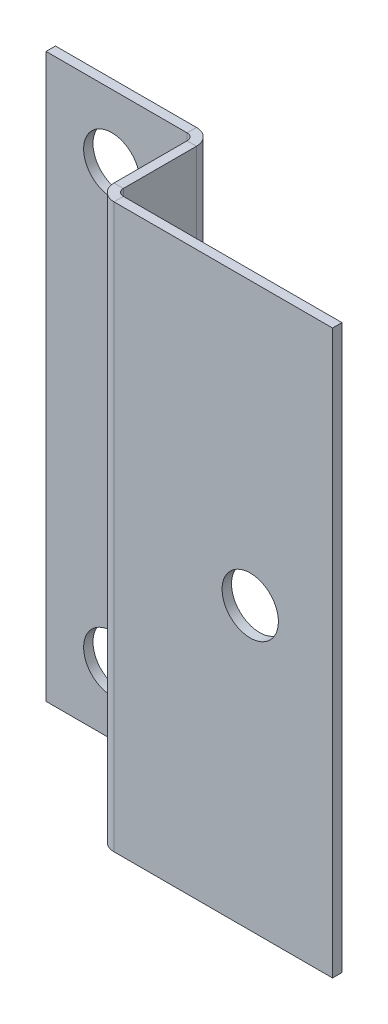
ISO-10303-21;
HEADER;
FILE_DESCRIPTION(('STEP AP214'),'2;1');
FILE_NAME('part.step','',(''),(''),'','','');
FILE_SCHEMA(('AUTOMOTIVE_DESIGN { 1 0 10303 214 1 1 1 1 }'));
ENDSEC;
DATA;
#1=APPLICATION_CONTEXT('core data for automotive mechanical design processes');
#2=APPLICATION_PROTOCOL_DEFINITION('international standard','automotive_design',2000,#1);
#3=PRODUCT_CONTEXT('',#1,'mechanical');
#4=PRODUCT('Part','Part','',(#3));
#5=PRODUCT_RELATED_PRODUCT_CATEGORY('part','',(#4));
#6=PRODUCT_DEFINITION_FORMATION('','',#4);
#7=PRODUCT_DEFINITION_CONTEXT('part definition',#1,'design');
#8=PRODUCT_DEFINITION('design','',#6,#7);
#9=PRODUCT_DEFINITION_SHAPE('','',#8);
#10=(LENGTH_UNIT() NAMED_UNIT(*) SI_UNIT(.MILLI.,.METRE.));
#11=(NAMED_UNIT(*) PLANE_ANGLE_UNIT() SI_UNIT($,.RADIAN.));
#12=(NAMED_UNIT(*) SI_UNIT($,.STERADIAN.) SOLID_ANGLE_UNIT());
#13=UNCERTAINTY_MEASURE_WITH_UNIT(LENGTH_MEASURE(1.E-05),#10,'distance_accuracy_value','');
#14=(GEOMETRIC_REPRESENTATION_CONTEXT(3) GLOBAL_UNCERTAINTY_ASSIGNED_CONTEXT((#13)) GLOBAL_UNIT_ASSIGNED_CONTEXT((#10,
#11,#12)) REPRESENTATION_CONTEXT('',''));
#15=CARTESIAN_POINT('',(0.,0.,0.));
#16=DIRECTION('',(0.,0.,1.));
#17=DIRECTION('',(1.,0.,0.));
#18=AXIS2_PLACEMENT_3D('',#15,#16,#17);
#19=CARTESIAN_POINT('',(-9.23462336885732,0.,8.76537663114272));
#20=DIRECTION('',(1.,0.,0.));
#21=DIRECTION('',(0.,0.,-1.));
#22=AXIS2_PLACEMENT_3D('',#19,#20,#21);
#23=PLANE('',#22);
#24=DIRECTION('',(0.,0.,1.));
#25=VECTOR('',#24,1.);
#26=CARTESIAN_POINT('',(-9.23462336885723,-30.,-16.2346233688573));
#27=LINE('',#26,#25);
#28=CARTESIAN_POINT('',(-9.23462336885729,-30.,0.736600000000002));
#29=VERTEX_POINT('',#28);
#30=CARTESIAN_POINT('',(-9.23462336885732,-30.,8.5287766311427));
#31=VERTEX_POINT('',#30);
#32=EDGE_CURVE('E74',#29,#31,#27,.T.);
#33=ORIENTED_EDGE('',*,*,#32,.T.);
#34=DIRECTION('',(0.,1.,0.));
#35=VECTOR('',#34,1.);
#36=CARTESIAN_POINT('',(-9.23462336885732,0.,8.5287766311427));
#37=LINE('',#36,#35);
#38=CARTESIAN_POINT('',(-9.23462336885732,30.,8.5287766311427));
#39=VERTEX_POINT('',#38);
#40=EDGE_CURVE('E66',#31,#39,#37,.T.);
#41=ORIENTED_EDGE('',*,*,#40,.T.);
#42=DIRECTION('',(0.,0.,-1.));
#43=VECTOR('',#42,1.);
#44=CARTESIAN_POINT('',(-9.23462336885724,30.,-16.2346233688573));
#45=LINE('',#44,#43);
#46=CARTESIAN_POINT('',(-9.23462336885729,30.,0.736600000000009));
#47=VERTEX_POINT('',#46);
#48=EDGE_CURVE('E82',#39,#47,#45,.T.);
#49=ORIENTED_EDGE('',*,*,#48,.T.);
#50=DIRECTION('',(0.,-1.,0.));
#51=VECTOR('',#50,1.);
#52=CARTESIAN_POINT('',(-9.23462336885729,0.,0.736600000000004));
#53=LINE('',#52,#51);
#54=EDGE_CURVE('E244',#47,#29,#53,.T.);
#55=ORIENTED_EDGE('',*,*,#54,.T.);
#56=EDGE_LOOP('',(#33,#41,#49,#55));
#57=FACE_BOUND('',#56,.T.);
#58=ADVANCED_FACE('F57',(#57),#23,.F.);
#59=CARTESIAN_POINT('',(-8.23462336885723,-30.,-16.2346233688573));
#60=DIRECTION('',(0.,-1.,0.));
#61=DIRECTION('',(1.,0.,0.));
#62=AXIS2_PLACEMENT_3D('',#59,#60,#61);
#63=PLANE('',#62);
#64=DIRECTION('',(1.,0.,0.));
#65=VECTOR('',#64,1.);
#66=CARTESIAN_POINT('',(-8.23462336885731,-30.,8.5287766311427));
#67=LINE('',#66,#65);
#68=CARTESIAN_POINT('',(-8.23462336885732,-30.,8.5287766311427));
#69=VERTEX_POINT('',#68);
#70=EDGE_CURVE('E14',#31,#69,#67,.T.);
#71=ORIENTED_EDGE('',*,*,#70,.F.);
#72=ORIENTED_EDGE('',*,*,#32,.F.);
#73=DIRECTION('',(-1.,0.,0.));
#74=VECTOR('',#73,1.);
#75=CARTESIAN_POINT('',(-8.23462336885729,-30.,0.736600000000006));
#76=LINE('',#75,#74);
#77=CARTESIAN_POINT('',(-8.23462336885729,-30.,0.736600000000005));
#78=VERTEX_POINT('',#77);
#79=EDGE_CURVE('E240',#78,#29,#76,.T.);
#80=ORIENTED_EDGE('',*,*,#79,.F.);
#81=DIRECTION('',(0.,0.,1.));
#82=VECTOR('',#81,1.);
#83=CARTESIAN_POINT('',(-8.23462336885723,-30.,-16.2346233688573));
#84=LINE('',#83,#82);
#85=EDGE_CURVE('E241',#78,#69,#84,.T.);
#86=ORIENTED_EDGE('',*,*,#85,.T.);
#87=EDGE_LOOP('',(#71,#72,#80,#86));
#88=FACE_BOUND('',#87,.T.);
#89=ADVANCED_FACE('F59',(#88),#63,.T.);
#90=CARTESIAN_POINT('',(-8.23462336885724,30.,-16.2346233688573));
#91=DIRECTION('',(0.,1.,0.));
#92=DIRECTION('',(-1.,0.,0.));
#93=AXIS2_PLACEMENT_3D('',#90,#91,#92);
#94=PLANE('',#93);
#95=DIRECTION('',(-1.,0.,0.));
#96=VECTOR('',#95,1.);
#97=CARTESIAN_POINT('',(-8.23462336885732,30.,8.52877663114271));
#98=LINE('',#97,#96);
#99=CARTESIAN_POINT('',(-8.23462336885732,30.,8.5287766311427));
#100=VERTEX_POINT('',#99);
#101=EDGE_CURVE('E252',#100,#39,#98,.T.);
#102=ORIENTED_EDGE('',*,*,#101,.F.);
#103=DIRECTION('',(0.,0.,-1.));
#104=VECTOR('',#103,1.);
#105=CARTESIAN_POINT('',(-8.23462336885724,30.,-16.2346233688573));
#106=LINE('',#105,#104);
#107=CARTESIAN_POINT('',(-8.23462336885729,30.,0.736600000000013));
#108=VERTEX_POINT('',#107);
#109=EDGE_CURVE('E257',#100,#108,#106,.T.);
#110=ORIENTED_EDGE('',*,*,#109,.T.);
#111=DIRECTION('',(1.,0.,0.));
#112=VECTOR('',#111,1.);
#113=CARTESIAN_POINT('',(-8.23462336885729,30.,0.736600000000006));
#114=LINE('',#113,#112);
#115=EDGE_CURVE('E246',#47,#108,#114,.T.);
#116=ORIENTED_EDGE('',*,*,#115,.F.);
#117=ORIENTED_EDGE('',*,*,#48,.F.);
#118=EDGE_LOOP('',(#102,#110,#116,#117));
#119=FACE_BOUND('',#118,.T.);
#120=ADVANCED_FACE('F310',(#119),#94,.T.);
#121=CARTESIAN_POINT('',(-8.23462336885732,0.,8.76537663114272));
#122=DIRECTION('',(1.,0.,0.));
#123=DIRECTION('',(0.,0.,-1.));
#124=AXIS2_PLACEMENT_3D('',#121,#122,#123);
#125=PLANE('',#124);
#126=DIRECTION('',(0.,1.,0.));
#127=VECTOR('',#126,1.);
#128=CARTESIAN_POINT('',(-8.23462336885732,0.,8.5287766311427));
#129=LINE('',#128,#127);
#130=EDGE_CURVE('E249',#69,#100,#129,.T.);
#131=ORIENTED_EDGE('',*,*,#130,.F.);
#132=ORIENTED_EDGE('',*,*,#85,.F.);
#133=DIRECTION('',(0.,-1.,0.));
#134=VECTOR('',#133,1.);
#135=CARTESIAN_POINT('',(-8.23462336885729,0.,0.736600000000007));
#136=LINE('',#135,#134);
#137=EDGE_CURVE('E237',#108,#78,#136,.T.);
#138=ORIENTED_EDGE('',*,*,#137,.F.);
#139=ORIENTED_EDGE('',*,*,#109,.F.);
#140=EDGE_LOOP('',(#131,#132,#138,#139));
#141=FACE_BOUND('',#140,.T.);
#142=ADVANCED_FACE('F301',(#141),#125,.T.);
#143=CARTESIAN_POINT('',(-25.,-30.,-1.));
#144=DIRECTION('',(-1.,0.,0.));
#145=DIRECTION('',(0.,0.,1.));
#146=AXIS2_PLACEMENT_3D('',#143,#144,#145);
#147=PLANE('',#146);
#148=DIRECTION('',(0.,-1.,0.));
#149=VECTOR('',#148,1.);
#150=CARTESIAN_POINT('',(-25.,-30.,0.));
#151=LINE('',#150,#149);
#152=CARTESIAN_POINT('',(-25.,30.,0.));
#153=VERTEX_POINT('',#152);
#154=CARTESIAN_POINT('',(-25.,-30.,0.));
#155=VERTEX_POINT('',#154);
#156=EDGE_CURVE('E216',#153,#155,#151,.T.);
#157=ORIENTED_EDGE('',*,*,#156,.F.);
#158=DIRECTION('',(0.,0.,1.));
#159=VECTOR('',#158,1.);
#160=CARTESIAN_POINT('',(-25.,30.,-1.));
#161=LINE('',#160,#159);
#162=CARTESIAN_POINT('',(-25.,30.,-1.));
#163=VERTEX_POINT('',#162);
#164=EDGE_CURVE('E205',#163,#153,#161,.T.);
#165=ORIENTED_EDGE('',*,*,#164,.F.);
#166=DIRECTION('',(0.,-1.,0.));
#167=VECTOR('',#166,1.);
#168=CARTESIAN_POINT('',(-25.,-30.,-1.));
#169=LINE('',#168,#167);
#170=CARTESIAN_POINT('',(-25.,-30.,-1.));
#171=VERTEX_POINT('',#170);
#172=EDGE_CURVE('E232',#163,#171,#169,.T.);
#173=ORIENTED_EDGE('',*,*,#172,.T.);
#174=DIRECTION('',(0.,0.,1.));
#175=VECTOR('',#174,1.);
#176=CARTESIAN_POINT('',(-25.,-30.,-1.));
#177=LINE('',#176,#175);
#178=EDGE_CURVE('E230',#171,#155,#177,.T.);
#179=ORIENTED_EDGE('',*,*,#178,.T.);
#180=EDGE_LOOP('',(#157,#165,#173,#179));
#181=FACE_BOUND('',#180,.T.);
#182=ADVANCED_FACE('F330',(#181),#147,.T.);
#183=CARTESIAN_POINT('',(0.,0.,-1.));
#184=DIRECTION('',(0.,0.,-1.));
#185=DIRECTION('',(-1.,0.,0.));
#186=AXIS2_PLACEMENT_3D('',#183,#184,#185);
#187=PLANE('',#186);
#188=CARTESIAN_POINT('',(-18.,-23.,-1.));
#189=DIRECTION('',(0.,0.,-1.));
#190=DIRECTION('',(-1.,0.,0.));
#191=AXIS2_PLACEMENT_3D('',#188,#189,#190);
#192=CIRCLE('',#191,3.);
#193=CARTESIAN_POINT('',(-21.,-23.,-1.));
#194=VERTEX_POINT('',#193);
#195=EDGE_CURVE('E265',#194,#194,#192,.T.);
#196=ORIENTED_EDGE('',*,*,#195,.F.);
#197=EDGE_LOOP('',(#196));
#198=FACE_BOUND('',#197,.T.);
#199=CARTESIAN_POINT('',(-18.,23.,-1.));
#200=DIRECTION('',(0.,0.,-1.));
#201=DIRECTION('',(-1.,0.,0.));
#202=AXIS2_PLACEMENT_3D('',#199,#200,#201);
#203=CIRCLE('',#202,3.);
#204=CARTESIAN_POINT('',(-21.,23.,-1.));
#205=VERTEX_POINT('',#204);
#206=EDGE_CURVE('E262',#205,#205,#203,.T.);
#207=ORIENTED_EDGE('',*,*,#206,.F.);
#208=EDGE_LOOP('',(#207));
#209=FACE_BOUND('',#208,.T.);
#210=DIRECTION('',(-1.,0.,0.));
#211=VECTOR('',#210,1.);
#212=CARTESIAN_POINT('',(-25.,30.,-1.));
#213=LINE('',#212,#211);
#214=CARTESIAN_POINT('',(-9.97122336885729,30.,-1.));
#215=VERTEX_POINT('',#214);
#216=EDGE_CURVE('E208',#215,#163,#213,.T.);
#217=ORIENTED_EDGE('',*,*,#216,.F.);
#218=DIRECTION('',(0.,-1.,0.));
#219=VECTOR('',#218,1.);
#220=CARTESIAN_POINT('',(-9.97122336885729,0.,-1.));
#221=LINE('',#220,#219);
#222=CARTESIAN_POINT('',(-9.97122336885728,-30.,-1.));
#223=VERTEX_POINT('',#222);
#224=EDGE_CURVE('E227',#215,#223,#221,.T.);
#225=ORIENTED_EDGE('',*,*,#224,.T.);
#226=DIRECTION('',(1.,0.,0.));
#227=VECTOR('',#226,1.);
#228=CARTESIAN_POINT('',(-25.,-30.,-1.));
#229=LINE('',#228,#227);
#230=EDGE_CURVE('E224',#171,#223,#229,.T.);
#231=ORIENTED_EDGE('',*,*,#230,.F.);
#232=ORIENTED_EDGE('',*,*,#172,.F.);
#233=EDGE_LOOP('',(#217,#225,#231,#232));
#234=FACE_BOUND('',#233,.T.);
#235=ADVANCED_FACE('F322',(#198,#209,#234),#187,.T.);
#236=CARTESIAN_POINT('',(-25.,-30.,-1.));
#237=DIRECTION('',(0.,-1.,0.));
#238=DIRECTION('',(0.,0.,-1.));
#239=AXIS2_PLACEMENT_3D('',#236,#237,#238);
#240=PLANE('',#239);
#241=ORIENTED_EDGE('',*,*,#230,.T.);
#242=DIRECTION('',(0.,0.,1.));
#243=VECTOR('',#242,1.);
#244=CARTESIAN_POINT('',(-9.97122336885728,-30.,-1.));
#245=LINE('',#244,#243);
#246=CARTESIAN_POINT('',(-9.97122336885729,-30.,0.));
#247=VERTEX_POINT('',#246);
#248=EDGE_CURVE('E221',#223,#247,#245,.T.);
#249=ORIENTED_EDGE('',*,*,#248,.T.);
#250=DIRECTION('',(1.,0.,0.));
#251=VECTOR('',#250,1.);
#252=CARTESIAN_POINT('',(-25.,-30.,0.));
#253=LINE('',#252,#251);
#254=EDGE_CURVE('E213',#155,#247,#253,.T.);
#255=ORIENTED_EDGE('',*,*,#254,.F.);
#256=ORIENTED_EDGE('',*,*,#178,.F.);
#257=EDGE_LOOP('',(#241,#249,#255,#256));
#258=FACE_BOUND('',#257,.T.);
#259=ADVANCED_FACE('F325',(#258),#240,.T.);
#260=CARTESIAN_POINT('',(0.,0.,0.));
#261=DIRECTION('',(0.,0.,-1.));
#262=DIRECTION('',(-1.,0.,0.));
#263=AXIS2_PLACEMENT_3D('',#260,#261,#262);
#264=PLANE('',#263);
#265=CARTESIAN_POINT('',(-18.,-23.,0.));
#266=DIRECTION('',(0.,0.,-1.));
#267=DIRECTION('',(-1.,0.,0.));
#268=AXIS2_PLACEMENT_3D('',#265,#266,#267);
#269=CIRCLE('',#268,3.);
#270=CARTESIAN_POINT('',(-21.,-23.,0.));
#271=VERTEX_POINT('',#270);
#272=EDGE_CURVE('E263',#271,#271,#269,.T.);
#273=ORIENTED_EDGE('',*,*,#272,.T.);
#274=EDGE_LOOP('',(#273));
#275=FACE_BOUND('',#274,.T.);
#276=CARTESIAN_POINT('',(-18.,23.,0.));
#277=DIRECTION('',(0.,0.,-1.));
#278=DIRECTION('',(-1.,0.,0.));
#279=AXIS2_PLACEMENT_3D('',#276,#277,#278);
#280=CIRCLE('',#279,3.);
#281=CARTESIAN_POINT('',(-21.,23.,0.));
#282=VERTEX_POINT('',#281);
#283=EDGE_CURVE('E178',#282,#282,#280,.T.);
#284=ORIENTED_EDGE('',*,*,#283,.T.);
#285=EDGE_LOOP('',(#284));
#286=FACE_BOUND('',#285,.T.);
#287=DIRECTION('',(0.,-1.,0.));
#288=VECTOR('',#287,1.);
#289=CARTESIAN_POINT('',(-9.97122336885729,0.,0.));
#290=LINE('',#289,#288);
#291=CARTESIAN_POINT('',(-9.97122336885729,30.,0.));
#292=VERTEX_POINT('',#291);
#293=EDGE_CURVE('E201',#292,#247,#290,.T.);
#294=ORIENTED_EDGE('',*,*,#293,.F.);
#295=DIRECTION('',(-1.,0.,0.));
#296=VECTOR('',#295,1.);
#297=CARTESIAN_POINT('',(-25.,30.,0.));
#298=LINE('',#297,#296);
#299=EDGE_CURVE('E219',#292,#153,#298,.T.);
#300=ORIENTED_EDGE('',*,*,#299,.T.);
#301=ORIENTED_EDGE('',*,*,#156,.T.);
#302=ORIENTED_EDGE('',*,*,#254,.T.);
#303=EDGE_LOOP('',(#294,#300,#301,#302));
#304=FACE_BOUND('',#303,.T.);
#305=ADVANCED_FACE('F360',(#275,#286,#304),#264,.F.);
#306=CARTESIAN_POINT('',(-25.,30.,-1.));
#307=DIRECTION('',(0.,1.,0.));
#308=DIRECTION('',(0.,0.,1.));
#309=AXIS2_PLACEMENT_3D('',#306,#307,#308);
#310=PLANE('',#309);
#311=ORIENTED_EDGE('',*,*,#299,.F.);
#312=DIRECTION('',(0.,0.,-1.));
#313=VECTOR('',#312,1.);
#314=CARTESIAN_POINT('',(-9.97122336885729,30.,-1.));
#315=LINE('',#314,#313);
#316=EDGE_CURVE('E210',#292,#215,#315,.T.);
#317=ORIENTED_EDGE('',*,*,#316,.T.);
#318=ORIENTED_EDGE('',*,*,#216,.T.);
#319=ORIENTED_EDGE('',*,*,#164,.T.);
#320=EDGE_LOOP('',(#311,#317,#318,#319));
#321=FACE_BOUND('',#320,.T.);
#322=ADVANCED_FACE('F333',(#321),#310,.T.);
#323=CARTESIAN_POINT('',(-9.97122336885729,30.,0.7366));
#324=DIRECTION('',(0.,1.,0.));
#325=DIRECTION('',(0.,0.,1.));
#326=AXIS2_PLACEMENT_3D('',#323,#324,#325);
#327=PLANE('',#326);
#328=ORIENTED_EDGE('',*,*,#316,.F.);
#329=CARTESIAN_POINT('',(-9.97122336885729,30.,0.7366));
#330=DIRECTION('',(0.,-1.,0.));
#331=DIRECTION('',(1.,0.,0.));
#332=AXIS2_PLACEMENT_3D('',#329,#330,#331);
#333=CIRCLE('',#332,0.7366);
#334=EDGE_CURVE('E189',#292,#47,#333,.T.);
#335=ORIENTED_EDGE('',*,*,#334,.T.);
#336=ORIENTED_EDGE('',*,*,#115,.T.);
#337=CARTESIAN_POINT('',(-9.97122336885729,30.,0.7366));
#338=DIRECTION('',(0.,-1.,0.));
#339=DIRECTION('',(0.,0.,1.));
#340=AXIS2_PLACEMENT_3D('',#337,#338,#339);
#341=CIRCLE('',#340,1.7366);
#342=EDGE_CURVE('E194',#215,#108,#341,.T.);
#343=ORIENTED_EDGE('',*,*,#342,.F.);
#344=EDGE_LOOP('',(#328,#335,#336,#343));
#345=FACE_BOUND('',#344,.T.);
#346=ADVANCED_FACE('F316',(#345),#327,.T.);
#347=CARTESIAN_POINT('',(-9.97122336885728,-30.,0.7366));
#348=DIRECTION('',(0.,-1.,0.));
#349=DIRECTION('',(0.,0.,-1.));
#350=AXIS2_PLACEMENT_3D('',#347,#348,#349);
#351=PLANE('',#350);
#352=CARTESIAN_POINT('',(-9.97122336885728,-30.,0.7366));
#353=DIRECTION('',(0.,-1.,0.));
#354=DIRECTION('',(1.,0.,0.));
#355=AXIS2_PLACEMENT_3D('',#352,#353,#354);
#356=CIRCLE('',#355,0.7366);
#357=EDGE_CURVE('E198',#29,#247,#356,.F.);
#358=ORIENTED_EDGE('',*,*,#357,.T.);
#359=ORIENTED_EDGE('',*,*,#248,.F.);
#360=CARTESIAN_POINT('',(-9.97122336885728,-30.,0.7366));
#361=DIRECTION('',(0.,1.,0.));
#362=DIRECTION('',(0.,0.,-1.));
#363=AXIS2_PLACEMENT_3D('',#360,#361,#362);
#364=CIRCLE('',#363,1.7366);
#365=EDGE_CURVE('E197',#78,#223,#364,.T.);
#366=ORIENTED_EDGE('',*,*,#365,.F.);
#367=ORIENTED_EDGE('',*,*,#79,.T.);
#368=EDGE_LOOP('',(#358,#359,#366,#367));
#369=FACE_BOUND('',#368,.T.);
#370=ADVANCED_FACE('F339',(#369),#351,.T.);
#371=CARTESIAN_POINT('',(-9.9712233688573,60.0397626521696,0.7366));
#372=DIRECTION('',(0.,-1.,0.));
#373=DIRECTION('',(1.,0.,0.));
#374=AXIS2_PLACEMENT_3D('',#371,#372,#373);
#375=CYLINDRICAL_SURFACE('',#374,1.7366);
#376=ORIENTED_EDGE('',*,*,#137,.T.);
#377=ORIENTED_EDGE('',*,*,#365,.T.);
#378=ORIENTED_EDGE('',*,*,#224,.F.);
#379=ORIENTED_EDGE('',*,*,#342,.T.);
#380=EDGE_LOOP('',(#376,#377,#378,#379));
#381=FACE_BOUND('',#380,.T.);
#382=ADVANCED_FACE('F319',(#381),#375,.T.);
#383=CARTESIAN_POINT('',(-9.9712233688573,60.0397626521696,0.7366));
#384=DIRECTION('',(0.,-1.,0.));
#385=DIRECTION('',(1.,0.,0.));
#386=AXIS2_PLACEMENT_3D('',#383,#384,#385);
#387=CYLINDRICAL_SURFACE('',#386,0.7366);
#388=ORIENTED_EDGE('',*,*,#54,.F.);
#389=ORIENTED_EDGE('',*,*,#334,.F.);
#390=ORIENTED_EDGE('',*,*,#293,.T.);
#391=ORIENTED_EDGE('',*,*,#357,.F.);
#392=EDGE_LOOP('',(#388,#389,#390,#391));
#393=FACE_BOUND('',#392,.T.);
#394=ADVANCED_FACE('F336',(#393),#387,.F.);
#395=CARTESIAN_POINT('',(-7.49802336885732,-30.,8.5287766311427));
#396=DIRECTION('',(0.,1.,0.));
#397=DIRECTION('',(0.,0.,1.));
#398=AXIS2_PLACEMENT_3D('',#395,#396,#397);
#399=PLANE('',#398);
#400=DIRECTION('',(0.,0.,-1.));
#401=VECTOR('',#400,1.);
#402=CARTESIAN_POINT('',(-7.49802336885731,-30.,9.2653766311427));
#403=LINE('',#402,#401);
#404=CARTESIAN_POINT('',(-7.49802336885731,-30.,10.2653766311427));
#405=VERTEX_POINT('',#404);
#406=CARTESIAN_POINT('',(-7.49802336885732,-30.,9.2653766311427));
#407=VERTEX_POINT('',#406);
#408=EDGE_CURVE('E155',#405,#407,#403,.T.);
#409=ORIENTED_EDGE('',*,*,#408,.F.);
#410=CARTESIAN_POINT('',(-7.49802336885732,-30.,8.5287766311427));
#411=DIRECTION('',(0.,-1.,0.));
#412=DIRECTION('',(1.,0.,0.));
#413=AXIS2_PLACEMENT_3D('',#410,#411,#412);
#414=CIRCLE('',#413,1.7366);
#415=EDGE_CURVE('E166',#405,#31,#414,.T.);
#416=ORIENTED_EDGE('',*,*,#415,.T.);
#417=ORIENTED_EDGE('',*,*,#70,.T.);
#418=CARTESIAN_POINT('',(-7.49802336885732,-30.,8.5287766311427));
#419=DIRECTION('',(0.,-1.,0.));
#420=DIRECTION('',(0.,0.,1.));
#421=AXIS2_PLACEMENT_3D('',#418,#419,#420);
#422=CIRCLE('',#421,0.7366);
#423=EDGE_CURVE('E182',#407,#69,#422,.T.);
#424=ORIENTED_EDGE('',*,*,#423,.F.);
#425=EDGE_LOOP('',(#409,#416,#417,#424));
#426=FACE_BOUND('',#425,.T.);
#427=ADVANCED_FACE('F304',(#426),#399,.F.);
#428=CARTESIAN_POINT('',(-7.49802336885732,30.,8.52877663114271));
#429=DIRECTION('',(0.,-1.,0.));
#430=DIRECTION('',(0.,0.,-1.));
#431=AXIS2_PLACEMENT_3D('',#428,#429,#430);
#432=PLANE('',#431);
#433=CARTESIAN_POINT('',(-7.49802336885732,30.,8.52877663114271));
#434=DIRECTION('',(0.,-1.,0.));
#435=DIRECTION('',(1.,0.,0.));
#436=AXIS2_PLACEMENT_3D('',#433,#434,#435);
#437=CIRCLE('',#436,1.7366);
#438=CARTESIAN_POINT('',(-7.49802336885732,30.,10.2653766311427));
#439=VERTEX_POINT('',#438);
#440=EDGE_CURVE('E186',#39,#439,#437,.F.);
#441=ORIENTED_EDGE('',*,*,#440,.T.);
#442=DIRECTION('',(0.,0.,1.));
#443=VECTOR('',#442,1.);
#444=CARTESIAN_POINT('',(-7.49802336885732,30.,9.26537663114271));
#445=LINE('',#444,#443);
#446=CARTESIAN_POINT('',(-7.49802336885732,30.,9.26537663114271));
#447=VERTEX_POINT('',#446);
#448=EDGE_CURVE('E284',#447,#439,#445,.T.);
#449=ORIENTED_EDGE('',*,*,#448,.F.);
#450=CARTESIAN_POINT('',(-7.49802336885732,30.,8.52877663114271));
#451=DIRECTION('',(0.,1.,0.));
#452=DIRECTION('',(0.,0.,-1.));
#453=AXIS2_PLACEMENT_3D('',#450,#451,#452);
#454=CIRCLE('',#453,0.7366);
#455=EDGE_CURVE('E185',#100,#447,#454,.T.);
#456=ORIENTED_EDGE('',*,*,#455,.F.);
#457=ORIENTED_EDGE('',*,*,#101,.T.);
#458=EDGE_LOOP('',(#441,#449,#456,#457));
#459=FACE_BOUND('',#458,.T.);
#460=ADVANCED_FACE('F295',(#459),#432,.F.);
#461=CARTESIAN_POINT('',(-7.49802336885733,60.0397626521696,8.52877663114271));
#462=DIRECTION('',(0.,-1.,0.));
#463=DIRECTION('',(1.,0.,0.));
#464=AXIS2_PLACEMENT_3D('',#461,#462,#463);
#465=CYLINDRICAL_SURFACE('',#464,0.7366);
#466=ORIENTED_EDGE('',*,*,#130,.T.);
#467=ORIENTED_EDGE('',*,*,#455,.T.);
#468=DIRECTION('',(0.,1.,0.));
#469=VECTOR('',#468,1.);
#470=CARTESIAN_POINT('',(-7.49802336885732,0.,9.2653766311427));
#471=LINE('',#470,#469);
#472=EDGE_CURVE('E175',#407,#447,#471,.T.);
#473=ORIENTED_EDGE('',*,*,#472,.F.);
#474=ORIENTED_EDGE('',*,*,#423,.T.);
#475=EDGE_LOOP('',(#466,#467,#473,#474));
#476=FACE_BOUND('',#475,.T.);
#477=ADVANCED_FACE('F297',(#476),#465,.F.);
#478=CARTESIAN_POINT('',(-7.49802336885733,60.0397626521696,8.52877663114271));
#479=DIRECTION('',(0.,-1.,0.));
#480=DIRECTION('',(1.,0.,0.));
#481=AXIS2_PLACEMENT_3D('',#478,#479,#480);
#482=CYLINDRICAL_SURFACE('',#481,1.7366);
#483=ORIENTED_EDGE('',*,*,#40,.F.);
#484=ORIENTED_EDGE('',*,*,#415,.F.);
#485=DIRECTION('',(0.,1.,0.));
#486=VECTOR('',#485,1.);
#487=CARTESIAN_POINT('',(-7.49802336885732,0.,10.2653766311427));
#488=LINE('',#487,#486);
#489=EDGE_CURVE('E173',#405,#439,#488,.T.);
#490=ORIENTED_EDGE('',*,*,#489,.T.);
#491=ORIENTED_EDGE('',*,*,#440,.F.);
#492=EDGE_LOOP('',(#483,#484,#490,#491));
#493=FACE_BOUND('',#492,.T.);
#494=ADVANCED_FACE('F309',(#493),#482,.T.);
#495=CARTESIAN_POINT('',(15.7961298934281,-30.,9.2653766311427));
#496=DIRECTION('',(1.,0.,0.));
#497=DIRECTION('',(0.,0.,-1.));
#498=AXIS2_PLACEMENT_3D('',#495,#496,#497);
#499=PLANE('',#498);
#500=DIRECTION('',(0.,1.,0.));
#501=VECTOR('',#500,1.);
#502=CARTESIAN_POINT('',(15.7961298934281,-30.,10.2653766311427));
#503=LINE('',#502,#501);
#504=CARTESIAN_POINT('',(15.7961298934281,-30.,10.2653766311427));
#505=VERTEX_POINT('',#504);
#506=CARTESIAN_POINT('',(15.7961298934281,30.,10.2653766311427));
#507=VERTEX_POINT('',#506);
#508=EDGE_CURVE('E165',#505,#507,#503,.T.);
#509=ORIENTED_EDGE('',*,*,#508,.F.);
#510=DIRECTION('',(0.,0.,1.));
#511=VECTOR('',#510,1.);
#512=CARTESIAN_POINT('',(15.7961298934281,-30.,9.2653766311427));
#513=LINE('',#512,#511);
#514=CARTESIAN_POINT('',(15.7961298934281,-30.,9.2653766311427));
#515=VERTEX_POINT('',#514);
#516=EDGE_CURVE('E152',#515,#505,#513,.T.);
#517=ORIENTED_EDGE('',*,*,#516,.F.);
#518=DIRECTION('',(0.,1.,0.));
#519=VECTOR('',#518,1.);
#520=CARTESIAN_POINT('',(15.7961298934281,-30.,9.2653766311427));
#521=LINE('',#520,#519);
#522=CARTESIAN_POINT('',(15.7961298934281,30.,9.26537663114271));
#523=VERTEX_POINT('',#522);
#524=EDGE_CURVE('E163',#515,#523,#521,.T.);
#525=ORIENTED_EDGE('',*,*,#524,.T.);
#526=DIRECTION('',(0.,0.,1.));
#527=VECTOR('',#526,1.);
#528=CARTESIAN_POINT('',(15.7961298934281,30.,9.26537663114271));
#529=LINE('',#528,#527);
#530=EDGE_CURVE('E172',#523,#507,#529,.T.);
#531=ORIENTED_EDGE('',*,*,#530,.T.);
#532=EDGE_LOOP('',(#509,#517,#525,#531));
#533=FACE_BOUND('',#532,.T.);
#534=ADVANCED_FACE('F162',(#533),#499,.T.);
#535=CARTESIAN_POINT('',(-9.20387010657187,0.,9.2653766311427));
#536=DIRECTION('',(0.,0.,-1.));
#537=DIRECTION('',(-1.,0.,0.));
#538=AXIS2_PLACEMENT_3D('',#535,#536,#537);
#539=PLANE('',#538);
#540=CARTESIAN_POINT('',(7.02537663114271,0.,9.2653766311427));
#541=DIRECTION('',(0.,0.,-1.));
#542=DIRECTION('',(0.,1.,0.));
#543=AXIS2_PLACEMENT_3D('',#540,#541,#542);
#544=CIRCLE('',#543,3.);
#545=CARTESIAN_POINT('',(7.02537663114271,3.,9.2653766311427));
#546=VERTEX_POINT('',#545);
#547=EDGE_CURVE('E275',#546,#546,#544,.T.);
#548=ORIENTED_EDGE('',*,*,#547,.F.);
#549=EDGE_LOOP('',(#548));
#550=FACE_BOUND('',#549,.T.);
#551=DIRECTION('',(1.,0.,0.));
#552=VECTOR('',#551,1.);
#553=CARTESIAN_POINT('',(-34.2038701065719,-30.,9.2653766311427));
#554=LINE('',#553,#552);
#555=EDGE_CURVE('E149',#407,#515,#554,.T.);
#556=ORIENTED_EDGE('',*,*,#555,.F.);
#557=ORIENTED_EDGE('',*,*,#472,.T.);
#558=DIRECTION('',(-1.,0.,0.));
#559=VECTOR('',#558,1.);
#560=CARTESIAN_POINT('',(-34.2038701065719,30.,9.26537663114271));
#561=LINE('',#560,#559);
#562=EDGE_CURVE('E171',#523,#447,#561,.T.);
#563=ORIENTED_EDGE('',*,*,#562,.F.);
#564=ORIENTED_EDGE('',*,*,#524,.F.);
#565=EDGE_LOOP('',(#556,#557,#563,#564));
#566=FACE_BOUND('',#565,.T.);
#567=ADVANCED_FACE('F169',(#550,#566),#539,.T.);
#568=CARTESIAN_POINT('',(-34.2038701065719,30.,9.26537663114271));
#569=DIRECTION('',(0.,1.,0.));
#570=DIRECTION('',(0.,0.,1.));
#571=AXIS2_PLACEMENT_3D('',#568,#569,#570);
#572=PLANE('',#571);
#573=ORIENTED_EDGE('',*,*,#562,.T.);
#574=ORIENTED_EDGE('',*,*,#448,.T.);
#575=DIRECTION('',(-1.,0.,0.));
#576=VECTOR('',#575,1.);
#577=CARTESIAN_POINT('',(-34.2038701065719,30.,10.2653766311427));
#578=LINE('',#577,#576);
#579=EDGE_CURVE('E279',#507,#439,#578,.T.);
#580=ORIENTED_EDGE('',*,*,#579,.F.);
#581=ORIENTED_EDGE('',*,*,#530,.F.);
#582=EDGE_LOOP('',(#573,#574,#580,#581));
#583=FACE_BOUND('',#582,.T.);
#584=ADVANCED_FACE('F291',(#583),#572,.T.);
#585=CARTESIAN_POINT('',(-9.20387010657187,0.,10.2653766311427));
#586=DIRECTION('',(0.,0.,-1.));
#587=DIRECTION('',(-1.,0.,0.));
#588=AXIS2_PLACEMENT_3D('',#585,#586,#587);
#589=PLANE('',#588);
#590=CARTESIAN_POINT('',(7.02537663114271,0.,10.2653766311427));
#591=DIRECTION('',(0.,0.,-1.));
#592=DIRECTION('',(0.,1.,0.));
#593=AXIS2_PLACEMENT_3D('',#590,#591,#592);
#594=CIRCLE('',#593,3.);
#595=CARTESIAN_POINT('',(7.02537663114271,3.,10.2653766311427));
#596=VERTEX_POINT('',#595);
#597=EDGE_CURVE('E61',#596,#596,#594,.T.);
#598=ORIENTED_EDGE('',*,*,#597,.T.);
#599=EDGE_LOOP('',(#598));
#600=FACE_BOUND('',#599,.T.);
#601=ORIENTED_EDGE('',*,*,#489,.F.);
#602=DIRECTION('',(1.,0.,0.));
#603=VECTOR('',#602,1.);
#604=CARTESIAN_POINT('',(-34.2038701065719,-30.,10.2653766311427));
#605=LINE('',#604,#603);
#606=EDGE_CURVE('E282',#405,#505,#605,.T.);
#607=ORIENTED_EDGE('',*,*,#606,.T.);
#608=ORIENTED_EDGE('',*,*,#508,.T.);
#609=ORIENTED_EDGE('',*,*,#579,.T.);
#610=EDGE_LOOP('',(#601,#607,#608,#609));
#611=FACE_BOUND('',#610,.T.);
#612=ADVANCED_FACE('F495',(#600,#611),#589,.F.);
#613=CARTESIAN_POINT('',(-34.2038701065719,-30.,9.2653766311427));
#614=DIRECTION('',(0.,-1.,0.));
#615=DIRECTION('',(0.,0.,-1.));
#616=AXIS2_PLACEMENT_3D('',#613,#614,#615);
#617=PLANE('',#616);
#618=ORIENTED_EDGE('',*,*,#606,.F.);
#619=ORIENTED_EDGE('',*,*,#408,.T.);
#620=ORIENTED_EDGE('',*,*,#555,.T.);
#621=ORIENTED_EDGE('',*,*,#516,.T.);
#622=EDGE_LOOP('',(#618,#619,#620,#621));
#623=FACE_BOUND('',#622,.T.);
#624=ADVANCED_FACE('F151',(#623),#617,.T.);
#625=CARTESIAN_POINT('',(-18.,23.,9.));
#626=DIRECTION('',(0.,0.,-1.));
#627=DIRECTION('',(-1.,0.,0.));
#628=AXIS2_PLACEMENT_3D('',#625,#626,#627);
#629=CYLINDRICAL_SURFACE('',#628,3.);
#630=ORIENTED_EDGE('',*,*,#206,.T.);
#631=EDGE_LOOP('',(#630));
#632=FACE_BOUND('',#631,.T.);
#633=ORIENTED_EDGE('',*,*,#283,.F.);
#634=EDGE_LOOP('',(#633));
#635=FACE_BOUND('',#634,.T.);
#636=ADVANCED_FACE('F504',(#632,#635),#629,.F.);
#637=CARTESIAN_POINT('',(-18.,-23.,9.));
#638=DIRECTION('',(0.,0.,-1.));
#639=DIRECTION('',(-1.,0.,0.));
#640=AXIS2_PLACEMENT_3D('',#637,#638,#639);
#641=CYLINDRICAL_SURFACE('',#640,3.);
#642=ORIENTED_EDGE('',*,*,#195,.T.);
#643=EDGE_LOOP('',(#642));
#644=FACE_BOUND('',#643,.T.);
#645=ORIENTED_EDGE('',*,*,#272,.F.);
#646=EDGE_LOOP('',(#645));
#647=FACE_BOUND('',#646,.T.);
#648=ADVANCED_FACE('F515',(#644,#647),#641,.F.);
#649=CARTESIAN_POINT('',(7.02537663114271,0.,19.2653766311427));
#650=DIRECTION('',(0.,0.,-1.));
#651=DIRECTION('',(0.,1.,0.));
#652=AXIS2_PLACEMENT_3D('',#649,#650,#651);
#653=CYLINDRICAL_SURFACE('',#652,3.);
#654=ORIENTED_EDGE('',*,*,#547,.T.);
#655=EDGE_LOOP('',(#654));
#656=FACE_BOUND('',#655,.T.);
#657=ORIENTED_EDGE('',*,*,#597,.F.);
#658=EDGE_LOOP('',(#657));
#659=FACE_BOUND('',#658,.T.);
#660=ADVANCED_FACE('F523',(#656,#659),#653,.F.);
#661=CLOSED_SHELL('',(#58,#89,#120,#142,#182,#235,#259,#305,#322,#346,#370,#382,#394,#427,#460,
#477,#494,#534,#567,#584,#612,#624,#636,#648,#660));
#662=MANIFOLD_SOLID_BREP('B2',#661);
#663=ADVANCED_BREP_SHAPE_REPRESENTATION('',(#18,#662),#14);
#664=SHAPE_DEFINITION_REPRESENTATION(#9,#663);
ENDSEC;
END-ISO-10303-21;
